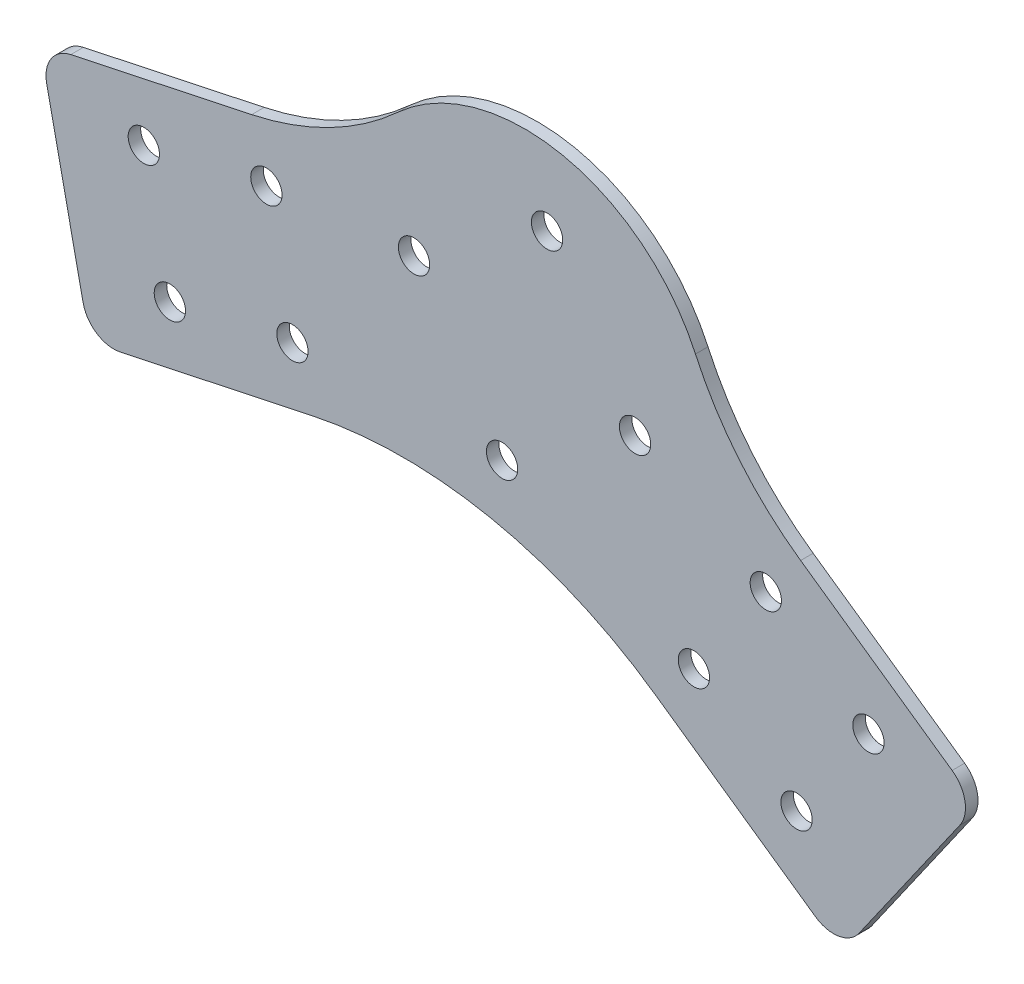
ISO-10303-21;
HEADER;
FILE_DESCRIPTION(('STEP AP214'),'2;1');
FILE_NAME('part.step','',(''),(''),'','','');
FILE_SCHEMA(('AUTOMOTIVE_DESIGN { 1 0 10303 214 1 1 1 1 }'));
ENDSEC;
DATA;
#1=APPLICATION_CONTEXT('core data for automotive mechanical design processes');
#2=APPLICATION_PROTOCOL_DEFINITION('international standard','automotive_design',2000,#1);
#3=PRODUCT_CONTEXT('',#1,'mechanical');
#4=PRODUCT('Part','Part','',(#3));
#5=PRODUCT_RELATED_PRODUCT_CATEGORY('part','',(#4));
#6=PRODUCT_DEFINITION_FORMATION('','',#4);
#7=PRODUCT_DEFINITION_CONTEXT('part definition',#1,'design');
#8=PRODUCT_DEFINITION('design','',#6,#7);
#9=PRODUCT_DEFINITION_SHAPE('','',#8);
#10=(LENGTH_UNIT() NAMED_UNIT(*) SI_UNIT(.MILLI.,.METRE.));
#11=(NAMED_UNIT(*) PLANE_ANGLE_UNIT() SI_UNIT($,.RADIAN.));
#12=(NAMED_UNIT(*) SI_UNIT($,.STERADIAN.) SOLID_ANGLE_UNIT());
#13=UNCERTAINTY_MEASURE_WITH_UNIT(LENGTH_MEASURE(1.E-05),#10,'distance_accuracy_value','');
#14=(GEOMETRIC_REPRESENTATION_CONTEXT(3) GLOBAL_UNCERTAINTY_ASSIGNED_CONTEXT((#13)) GLOBAL_UNIT_ASSIGNED_CONTEXT((#10,
#11,#12)) REPRESENTATION_CONTEXT('',''));
#15=CARTESIAN_POINT('',(0.,0.,0.));
#16=DIRECTION('',(0.,0.,1.));
#17=DIRECTION('',(1.,0.,0.));
#18=AXIS2_PLACEMENT_3D('',#15,#16,#17);
#19=CARTESIAN_POINT('',(0.,0.,2.));
#20=DIRECTION('',(0.,0.,1.));
#21=DIRECTION('',(1.,0.,0.));
#22=AXIS2_PLACEMENT_3D('',#19,#20,#21);
#23=PLANE('',#22);
#24=CARTESIAN_POINT('',(3.5886228195096,17.6386446831749,2.));
#25=DIRECTION('',(0.,0.,1.));
#26=DIRECTION('',(1.,0.,0.));
#27=AXIS2_PLACEMENT_3D('',#24,#25,#26);
#28=CIRCLE('',#27,2.5);
#29=CARTESIAN_POINT('',(6.0886228195096,17.6386446831749,2.));
#30=VERTEX_POINT('',#29);
#31=EDGE_CURVE('E551',#30,#30,#28,.T.);
#32=ORIENTED_EDGE('',*,*,#31,.F.);
#33=EDGE_LOOP('',(#32));
#34=FACE_BOUND('',#33,.T.);
#35=CARTESIAN_POINT('',(17.6386446831753,-3.58862281950917,2.));
#36=DIRECTION('',(0.,0.,1.));
#37=DIRECTION('',(1.,0.,0.));
#38=AXIS2_PLACEMENT_3D('',#35,#36,#37);
#39=CIRCLE('',#38,2.5);
#40=CARTESIAN_POINT('',(20.1386446831753,-3.58862281950917,2.));
#41=VERTEX_POINT('',#40);
#42=EDGE_CURVE('E539',#41,#41,#39,.T.);
#43=ORIENTED_EDGE('',*,*,#42,.F.);
#44=EDGE_LOOP('',(#43));
#45=FACE_BOUND('',#44,.T.);
#46=CARTESIAN_POINT('',(43.4133582938288,-42.6061066239529,2.));
#47=DIRECTION('',(0.,0.,1.));
#48=DIRECTION('',(1.,0.,0.));
#49=AXIS2_PLACEMENT_3D('',#46,#47,#48);
#50=CIRCLE('',#49,2.5);
#51=CARTESIAN_POINT('',(45.9133582938288,-42.6061066239529,2.));
#52=VERTEX_POINT('',#51);
#53=EDGE_CURVE('E527',#52,#52,#50,.T.);
#54=ORIENTED_EDGE('',*,*,#53,.F.);
#55=EDGE_LOOP('',(#54));
#56=FACE_BOUND('',#55,.T.);
#57=CARTESIAN_POINT('',(38.5018461350701,-14.7515370111521,2.));
#58=DIRECTION('',(0.,0.,1.));
#59=DIRECTION('',(1.,0.,0.));
#60=AXIS2_PLACEMENT_3D('',#57,#58,#59);
#61=CIRCLE('',#60,2.5);
#62=CARTESIAN_POINT('',(41.0018461350701,-14.7515370111521,2.));
#63=VERTEX_POINT('',#62);
#64=EDGE_CURVE('E515',#63,#63,#61,.T.);
#65=ORIENTED_EDGE('',*,*,#64,.F.);
#66=EDGE_LOOP('',(#65));
#67=FACE_BOUND('',#66,.T.);
#68=CARTESIAN_POINT('',(-37.0467871211747,-18.0979436400483,2.));
#69=DIRECTION('',(0.,0.,1.));
#70=DIRECTION('',(1.,0.,0.));
#71=AXIS2_PLACEMENT_3D('',#68,#69,#70);
#72=CIRCLE('',#71,2.49999999999999);
#73=CARTESIAN_POINT('',(-34.5467871211747,-18.0979436400483,2.));
#74=VERTEX_POINT('',#73);
#75=EDGE_CURVE('E504',#74,#74,#72,.T.);
#76=ORIENTED_EDGE('',*,*,#75,.F.);
#77=EDGE_LOOP('',(#76));
#78=FACE_BOUND('',#77,.T.);
#79=CARTESIAN_POINT('',(-60.7679729522059,-2.69322544172733,2.));
#80=DIRECTION('',(0.,0.,1.));
#81=DIRECTION('',(1.,0.,0.));
#82=AXIS2_PLACEMENT_3D('',#79,#80,#81);
#83=CIRCLE('',#82,2.49999999999999);
#84=CARTESIAN_POINT('',(-58.2679729522059,-2.69322544172733,2.));
#85=VERTEX_POINT('',#84);
#86=EDGE_CURVE('E172',#85,#85,#83,.T.);
#87=ORIENTED_EDGE('',*,*,#86,.F.);
#88=EDGE_LOOP('',(#87));
#89=FACE_BOUND('',#88,.T.);
#90=DIRECTION('',(0.57357643635105,0.819152044288989,0.));
#91=VECTOR('',#90,1.);
#92=CARTESIAN_POINT('',(50.5384510310042,-58.5821215678195,2.));
#93=LINE('',#92,#91);
#94=CARTESIAN_POINT('',(53.4063332127595,-54.4863613463746,2.));
#95=VERTEX_POINT('',#94);
#96=CARTESIAN_POINT('',(69.4664734305889,-31.5501041062829,2.));
#97=VERTEX_POINT('',#96);
#98=EDGE_CURVE('E269',#95,#97,#93,.T.);
#99=ORIENTED_EDGE('',*,*,#98,.T.);
#100=CARTESIAN_POINT('',(65.3707132091439,-28.6822219245277,2.));
#101=DIRECTION('',(0.,0.,1.));
#102=DIRECTION('',(1.,0.,0.));
#103=AXIS2_PLACEMENT_3D('',#100,#101,#102);
#104=CIRCLE('',#103,5.);
#105=CARTESIAN_POINT('',(68.2385953908992,-24.5864617030827,2.));
#106=VERTEX_POINT('',#105);
#107=EDGE_CURVE('E235',#97,#106,#104,.T.);
#108=ORIENTED_EDGE('',*,*,#107,.T.);
#109=DIRECTION('',(-0.819152044288989,0.57357643635105,0.));
#110=VECTOR('',#109,1.);
#111=CARTESIAN_POINT('',(72.3343556123441,-27.454343884838,2.));
#112=LINE('',#111,#110);
#113=CARTESIAN_POINT('',(44.0609664397997,-7.65710365548538,2.));
#114=VERTEX_POINT('',#113);
#115=EDGE_CURVE('E271',#106,#114,#112,.T.);
#116=ORIENTED_EDGE('',*,*,#115,.T.);
#117=CARTESIAN_POINT('',(72.7397882573522,33.3004985589641,2.));
#118=DIRECTION('',(0.,0.,1.));
#119=DIRECTION('',(1.,0.,0.));
#120=AXIS2_PLACEMENT_3D('',#117,#118,#119);
#121=CIRCLE('',#120,50.);
#122=CARTESIAN_POINT('',(27.2774205965071,12.4876869596115,2.));
#123=VERTEX_POINT('',#122);
#124=EDGE_CURVE('E202',#114,#123,#121,.F.);
#125=ORIENTED_EDGE('',*,*,#124,.T.);
#126=CARTESIAN_POINT('',(0.,0.,2.));
#127=DIRECTION('',(0.,0.,1.));
#128=DIRECTION('',(1.,0.,0.));
#129=AXIS2_PLACEMENT_3D('',#126,#127,#128);
#130=CIRCLE('',#129,30.);
#131=CARTESIAN_POINT('',(-20.2296700307983,22.1531137866671,2.));
#132=VERTEX_POINT('',#131);
#133=EDGE_CURVE('E164',#123,#132,#130,.T.);
#134=ORIENTED_EDGE('',*,*,#133,.T.);
#135=CARTESIAN_POINT('',(-53.9457867487956,59.0749700977789,2.));
#136=DIRECTION('',(0.,0.,1.));
#137=DIRECTION('',(1.,0.,0.));
#138=AXIS2_PLACEMENT_3D('',#135,#136,#137);
#139=CIRCLE('',#138,50.);
#140=CARTESIAN_POINT('',(-43.5502022079078,10.1675900610886,2.));
#141=VERTEX_POINT('',#140);
#142=EDGE_CURVE('E152',#132,#141,#139,.F.);
#143=ORIENTED_EDGE('',*,*,#142,.T.);
#144=DIRECTION('',(-0.978147600733806,-0.207911690817757,0.));
#145=VECTOR('',#144,1.);
#146=CARTESIAN_POINT('',(-77.3113921805728,2.99142760261058,2.));
#147=LINE('',#146,#145);
#148=CARTESIAN_POINT('',(-72.4206541769038,4.03098605669936,2.));
#149=VERTEX_POINT('',#148);
#150=EDGE_CURVE('E162',#141,#149,#147,.T.);
#151=ORIENTED_EDGE('',*,*,#150,.T.);
#152=CARTESIAN_POINT('',(-71.381095722815,-0.859751946969667,2.));
#153=DIRECTION('',(0.,0.,1.));
#154=DIRECTION('',(1.,0.,0.));
#155=AXIS2_PLACEMENT_3D('',#152,#153,#154);
#156=CIRCLE('',#155,5.);
#157=CARTESIAN_POINT('',(-76.271833726484,-1.89931040105845,2.));
#158=VERTEX_POINT('',#157);
#159=EDGE_CURVE('E230',#149,#158,#156,.T.);
#160=ORIENTED_EDGE('',*,*,#159,.T.);
#161=DIRECTION('',(0.207911690817756,-0.978147600733806,0.));
#162=VECTOR('',#161,1.);
#163=CARTESIAN_POINT('',(-77.3113921805728,2.99142760261058,2.));
#164=LINE('',#163,#162);
#165=CARTESIAN_POINT('',(-70.4503063835869,-29.287443221605,2.));
#166=VERTEX_POINT('',#165);
#167=EDGE_CURVE('E247',#158,#166,#164,.T.);
#168=ORIENTED_EDGE('',*,*,#167,.T.);
#169=CARTESIAN_POINT('',(-65.5595683799178,-28.2478847675162,2.));
#170=DIRECTION('',(0.,0.,1.));
#171=DIRECTION('',(1.,0.,0.));
#172=AXIS2_PLACEMENT_3D('',#169,#170,#171);
#173=CIRCLE('',#172,5.);
#174=CARTESIAN_POINT('',(-64.520009925829,-33.1386227711853,2.));
#175=VERTEX_POINT('',#174);
#176=EDGE_CURVE('E62',#166,#175,#173,.T.);
#177=ORIENTED_EDGE('',*,*,#176,.T.);
#178=DIRECTION('',(0.978147600733806,0.207911690817757,0.));
#179=VECTOR('',#178,1.);
#180=CARTESIAN_POINT('',(-69.4107479294981,-34.1781812252741,2.));
#181=LINE('',#180,#179);
#182=CARTESIAN_POINT('',(-33.9023285134918,-26.6306336838708,2.));
#183=VERTEX_POINT('',#182);
#184=EDGE_CURVE('E253',#175,#183,#181,.T.);
#185=ORIENTED_EDGE('',*,*,#184,.T.);
#186=CARTESIAN_POINT('',(-19.3485101562488,-95.1009657352373,2.));
#187=DIRECTION('',(0.,0.,1.));
#188=DIRECTION('',(1.,0.,0.));
#189=AXIS2_PLACEMENT_3D('',#186,#187,#188);
#190=CIRCLE('',#189,70.);
#191=CARTESIAN_POINT('',(20.8018403883247,-37.760322635008,2.));
#192=VERTEX_POINT('',#191);
#193=EDGE_CURVE('E213',#183,#192,#190,.F.);
#194=ORIENTED_EDGE('',*,*,#193,.T.);
#195=DIRECTION('',(0.819152044288989,-0.57357643635105,0.));
#196=VECTOR('',#195,1.);
#197=CARTESIAN_POINT('',(-4.13058081987337,-20.3024533592079,2.));
#198=LINE('',#197,#196);
#199=CARTESIAN_POINT('',(46.4426908095593,-55.7142393860643,2.));
#200=VERTEX_POINT('',#199);
#201=EDGE_CURVE('E266',#192,#200,#198,.T.);
#202=ORIENTED_EDGE('',*,*,#201,.T.);
#203=CARTESIAN_POINT('',(49.3105729913146,-51.6184791646194,2.));
#204=DIRECTION('',(0.,0.,1.));
#205=DIRECTION('',(1.,0.,0.));
#206=AXIS2_PLACEMENT_3D('',#203,#204,#205);
#207=CIRCLE('',#206,5.);
#208=EDGE_CURVE('E233',#200,#95,#207,.T.);
#209=ORIENTED_EDGE('',*,*,#208,.T.);
#210=EDGE_LOOP('',(#99,#108,#116,#125,#134,#143,#151,#160,#168,#177,#185,#194,#202,#209));
#211=FACE_BOUND('',#210,.T.);
#212=CARTESIAN_POINT('',(-56.6097391358508,-22.2561774564035,2.));
#213=DIRECTION('',(0.,0.,1.));
#214=DIRECTION('',(-1.,0.,0.));
#215=AXIS2_PLACEMENT_3D('',#212,#213,#214);
#216=CIRCLE('',#215,2.49999999999999);
#217=CARTESIAN_POINT('',(-59.1097391358508,-22.2561774564035,2.));
#218=VERTEX_POINT('',#217);
#219=EDGE_CURVE('E452',#218,#218,#216,.T.);
#220=ORIENTED_EDGE('',*,*,#219,.F.);
#221=EDGE_LOOP('',(#220));
#222=FACE_BOUND('',#221,.T.);
#223=CARTESIAN_POINT('',(-41.2050209375298,1.4650083746278,2.));
#224=DIRECTION('',(0.,0.,1.));
#225=DIRECTION('',(-1.,0.,0.));
#226=AXIS2_PLACEMENT_3D('',#223,#224,#225);
#227=CIRCLE('',#226,2.50000000000001);
#228=CARTESIAN_POINT('',(-43.7050209375298,1.4650083746278,2.));
#229=VERTEX_POINT('',#228);
#230=EDGE_CURVE('E509',#229,#229,#227,.T.);
#231=ORIENTED_EDGE('',*,*,#230,.F.);
#232=EDGE_LOOP('',(#231));
#233=FACE_BOUND('',#232,.T.);
#234=CARTESIAN_POINT('',(27.0303174080491,-31.1345778969319,2.));
#235=DIRECTION('',(0.,0.,1.));
#236=DIRECTION('',(-1.,0.,0.));
#237=AXIS2_PLACEMENT_3D('',#234,#235,#236);
#238=CIRCLE('',#237,2.5);
#239=CARTESIAN_POINT('',(24.5303174080491,-31.1345778969319,2.));
#240=VERTEX_POINT('',#239);
#241=EDGE_CURVE('E521',#240,#240,#238,.T.);
#242=ORIENTED_EDGE('',*,*,#241,.F.);
#243=EDGE_LOOP('',(#242));
#244=FACE_BOUND('',#243,.T.);
#245=CARTESIAN_POINT('',(54.8848870208499,-26.2230657381731,2.));
#246=DIRECTION('',(0.,0.,1.));
#247=DIRECTION('',(-1.,0.,0.));
#248=AXIS2_PLACEMENT_3D('',#245,#246,#247);
#249=CIRCLE('',#248,2.49999999999999);
#250=CARTESIAN_POINT('',(52.3848870208499,-26.2230657381731,2.));
#251=VERTEX_POINT('',#250);
#252=EDGE_CURVE('E533',#251,#251,#249,.T.);
#253=ORIENTED_EDGE('',*,*,#252,.F.);
#254=EDGE_LOOP('',(#253));
#255=FACE_BOUND('',#254,.T.);
#256=CARTESIAN_POINT('',(-3.58862281950875,-17.6386446831749,2.));
#257=DIRECTION('',(0.,0.,1.));
#258=DIRECTION('',(1.,0.,0.));
#259=AXIS2_PLACEMENT_3D('',#256,#257,#258);
#260=CIRCLE('',#259,2.5);
#261=CARTESIAN_POINT('',(-1.08862281950875,-17.6386446831749,2.));
#262=VERTEX_POINT('',#261);
#263=EDGE_CURVE('E545',#262,#262,#260,.T.);
#264=ORIENTED_EDGE('',*,*,#263,.F.);
#265=EDGE_LOOP('',(#264));
#266=FACE_BOUND('',#265,.T.);
#267=CARTESIAN_POINT('',(-17.6386446831745,3.58862281950917,2.));
#268=DIRECTION('',(0.,0.,1.));
#269=DIRECTION('',(1.,0.,0.));
#270=AXIS2_PLACEMENT_3D('',#267,#268,#269);
#271=CIRCLE('',#270,2.5);
#272=CARTESIAN_POINT('',(-15.1386446831745,3.58862281950917,2.));
#273=VERTEX_POINT('',#272);
#274=EDGE_CURVE('E557',#273,#273,#271,.T.);
#275=ORIENTED_EDGE('',*,*,#274,.F.);
#276=EDGE_LOOP('',(#275));
#277=FACE_BOUND('',#276,.T.);
#278=ADVANCED_FACE('F39',(#34,#45,#56,#67,#78,#89,#211,#222,#233,#244,#255,#266,#277),#23,.T.);
#279=CARTESIAN_POINT('',(0.,0.,0.));
#280=DIRECTION('',(0.,0.,1.));
#281=DIRECTION('',(1.,0.,0.));
#282=AXIS2_PLACEMENT_3D('',#279,#280,#281);
#283=PLANE('',#282);
#284=DIRECTION('',(-0.819152044288989,0.57357643635105,0.));
#285=VECTOR('',#284,1.);
#286=CARTESIAN_POINT('',(72.3343556123441,-27.454343884838,0.));
#287=LINE('',#286,#285);
#288=CARTESIAN_POINT('',(68.2385953908992,-24.5864617030827,0.));
#289=VERTEX_POINT('',#288);
#290=CARTESIAN_POINT('',(44.0609664397997,-7.65710365548538,0.));
#291=VERTEX_POINT('',#290);
#292=EDGE_CURVE('E189',#289,#291,#287,.T.);
#293=ORIENTED_EDGE('',*,*,#292,.F.);
#294=CARTESIAN_POINT('',(65.3707132091439,-28.6822219245277,0.));
#295=DIRECTION('',(0.,0.,1.));
#296=DIRECTION('',(1.,0.,0.));
#297=AXIS2_PLACEMENT_3D('',#294,#295,#296);
#298=CIRCLE('',#297,5.);
#299=CARTESIAN_POINT('',(69.4664734305889,-31.5501041062829,0.));
#300=VERTEX_POINT('',#299);
#301=EDGE_CURVE('E223',#289,#300,#298,.F.);
#302=ORIENTED_EDGE('',*,*,#301,.T.);
#303=DIRECTION('',(0.57357643635105,0.819152044288989,0.));
#304=VECTOR('',#303,1.);
#305=CARTESIAN_POINT('',(50.5384510310042,-58.5821215678195,0.));
#306=LINE('',#305,#304);
#307=CARTESIAN_POINT('',(53.4063332127595,-54.4863613463746,0.));
#308=VERTEX_POINT('',#307);
#309=EDGE_CURVE('E186',#308,#300,#306,.T.);
#310=ORIENTED_EDGE('',*,*,#309,.F.);
#311=CARTESIAN_POINT('',(49.3105729913146,-51.6184791646194,0.));
#312=DIRECTION('',(0.,0.,1.));
#313=DIRECTION('',(1.,0.,0.));
#314=AXIS2_PLACEMENT_3D('',#311,#312,#313);
#315=CIRCLE('',#314,5.);
#316=CARTESIAN_POINT('',(46.4426908095593,-55.7142393860643,0.));
#317=VERTEX_POINT('',#316);
#318=EDGE_CURVE('E221',#308,#317,#315,.F.);
#319=ORIENTED_EDGE('',*,*,#318,.T.);
#320=DIRECTION('',(0.819152044288989,-0.57357643635105,0.));
#321=VECTOR('',#320,1.);
#322=CARTESIAN_POINT('',(-4.13058081987337,-20.3024533592079,0.));
#323=LINE('',#322,#321);
#324=CARTESIAN_POINT('',(20.8018403883247,-37.760322635008,0.));
#325=VERTEX_POINT('',#324);
#326=EDGE_CURVE('E184',#325,#317,#323,.T.);
#327=ORIENTED_EDGE('',*,*,#326,.F.);
#328=CARTESIAN_POINT('',(-19.3485101562488,-95.1009657352373,0.));
#329=DIRECTION('',(0.,0.,1.));
#330=DIRECTION('',(1.,0.,0.));
#331=AXIS2_PLACEMENT_3D('',#328,#329,#330);
#332=CIRCLE('',#331,70.);
#333=CARTESIAN_POINT('',(-33.9023285134918,-26.6306336838708,0.));
#334=VERTEX_POINT('',#333);
#335=EDGE_CURVE('E210',#325,#334,#332,.T.);
#336=ORIENTED_EDGE('',*,*,#335,.T.);
#337=DIRECTION('',(0.978147600733806,0.207911690817757,0.));
#338=VECTOR('',#337,1.);
#339=CARTESIAN_POINT('',(-69.4107479294981,-34.1781812252741,0.));
#340=LINE('',#339,#338);
#341=CARTESIAN_POINT('',(-64.520009925829,-33.1386227711853,0.));
#342=VERTEX_POINT('',#341);
#343=EDGE_CURVE('E175',#342,#334,#340,.T.);
#344=ORIENTED_EDGE('',*,*,#343,.F.);
#345=CARTESIAN_POINT('',(-65.5595683799178,-28.2478847675162,0.));
#346=DIRECTION('',(0.,0.,1.));
#347=DIRECTION('',(1.,0.,0.));
#348=AXIS2_PLACEMENT_3D('',#345,#346,#347);
#349=CIRCLE('',#348,5.);
#350=CARTESIAN_POINT('',(-70.4503063835869,-29.287443221605,0.));
#351=VERTEX_POINT('',#350);
#352=EDGE_CURVE('E219',#342,#351,#349,.F.);
#353=ORIENTED_EDGE('',*,*,#352,.T.);
#354=DIRECTION('',(0.207911690817756,-0.978147600733806,0.));
#355=VECTOR('',#354,1.);
#356=CARTESIAN_POINT('',(-77.3113921805728,2.99142760261058,0.));
#357=LINE('',#356,#355);
#358=CARTESIAN_POINT('',(-76.271833726484,-1.89931040105845,0.));
#359=VERTEX_POINT('',#358);
#360=EDGE_CURVE('E171',#359,#351,#357,.T.);
#361=ORIENTED_EDGE('',*,*,#360,.F.);
#362=CARTESIAN_POINT('',(-71.381095722815,-0.859751946969667,0.));
#363=DIRECTION('',(0.,0.,1.));
#364=DIRECTION('',(1.,0.,0.));
#365=AXIS2_PLACEMENT_3D('',#362,#363,#364);
#366=CIRCLE('',#365,5.);
#367=CARTESIAN_POINT('',(-72.4206541769038,4.03098605669936,0.));
#368=VERTEX_POINT('',#367);
#369=EDGE_CURVE('E170',#359,#368,#366,.F.);
#370=ORIENTED_EDGE('',*,*,#369,.T.);
#371=DIRECTION('',(-0.978147600733806,-0.207911690817757,0.));
#372=VECTOR('',#371,1.);
#373=CARTESIAN_POINT('',(-77.3113921805728,2.99142760261058,0.));
#374=LINE('',#373,#372);
#375=CARTESIAN_POINT('',(-43.5502022079078,10.1675900610886,0.));
#376=VERTEX_POINT('',#375);
#377=EDGE_CURVE('E159',#376,#368,#374,.T.);
#378=ORIENTED_EDGE('',*,*,#377,.F.);
#379=CARTESIAN_POINT('',(-53.9457867487956,59.0749700977789,0.));
#380=DIRECTION('',(0.,0.,1.));
#381=DIRECTION('',(1.,0.,0.));
#382=AXIS2_PLACEMENT_3D('',#379,#380,#381);
#383=CIRCLE('',#382,50.);
#384=CARTESIAN_POINT('',(-20.2296700307983,22.1531137866671,0.));
#385=VERTEX_POINT('',#384);
#386=EDGE_CURVE('E142',#376,#385,#383,.T.);
#387=ORIENTED_EDGE('',*,*,#386,.T.);
#388=CARTESIAN_POINT('',(0.,0.,0.));
#389=DIRECTION('',(0.,0.,1.));
#390=DIRECTION('',(1.,0.,0.));
#391=AXIS2_PLACEMENT_3D('',#388,#389,#390);
#392=CIRCLE('',#391,30.);
#393=CARTESIAN_POINT('',(27.2774205965071,12.4876869596115,0.));
#394=VERTEX_POINT('',#393);
#395=EDGE_CURVE('E191',#394,#385,#392,.T.);
#396=ORIENTED_EDGE('',*,*,#395,.F.);
#397=CARTESIAN_POINT('',(72.7397882573522,33.3004985589641,0.));
#398=DIRECTION('',(0.,0.,1.));
#399=DIRECTION('',(1.,0.,0.));
#400=AXIS2_PLACEMENT_3D('',#397,#398,#399);
#401=CIRCLE('',#400,50.);
#402=EDGE_CURVE('E199',#394,#291,#401,.T.);
#403=ORIENTED_EDGE('',*,*,#402,.T.);
#404=EDGE_LOOP('',(#293,#302,#310,#319,#327,#336,#344,#353,#361,#370,#378,#387,#396,#403));
#405=FACE_BOUND('',#404,.T.);
#406=CARTESIAN_POINT('',(-60.7679729522059,-2.69322544172733,0.));
#407=DIRECTION('',(0.,0.,1.));
#408=DIRECTION('',(1.,0.,0.));
#409=AXIS2_PLACEMENT_3D('',#406,#407,#408);
#410=CIRCLE('',#409,2.49999999999999);
#411=CARTESIAN_POINT('',(-58.2679729522059,-2.69322544172733,0.));
#412=VERTEX_POINT('',#411);
#413=EDGE_CURVE('E178',#412,#412,#410,.T.);
#414=ORIENTED_EDGE('',*,*,#413,.T.);
#415=EDGE_LOOP('',(#414));
#416=FACE_BOUND('',#415,.T.);
#417=CARTESIAN_POINT('',(-56.6097391358508,-22.2561774564035,0.));
#418=DIRECTION('',(0.,0.,1.));
#419=DIRECTION('',(-1.,0.,0.));
#420=AXIS2_PLACEMENT_3D('',#417,#418,#419);
#421=CIRCLE('',#420,2.49999999999999);
#422=CARTESIAN_POINT('',(-59.1097391358508,-22.2561774564035,0.));
#423=VERTEX_POINT('',#422);
#424=EDGE_CURVE('E455',#423,#423,#421,.T.);
#425=ORIENTED_EDGE('',*,*,#424,.T.);
#426=EDGE_LOOP('',(#425));
#427=FACE_BOUND('',#426,.T.);
#428=CARTESIAN_POINT('',(-37.0467871211747,-18.0979436400483,0.));
#429=DIRECTION('',(0.,0.,1.));
#430=DIRECTION('',(1.,0.,0.));
#431=AXIS2_PLACEMENT_3D('',#428,#429,#430);
#432=CIRCLE('',#431,2.49999999999999);
#433=CARTESIAN_POINT('',(-34.5467871211747,-18.0979436400483,0.));
#434=VERTEX_POINT('',#433);
#435=EDGE_CURVE('E506',#434,#434,#432,.T.);
#436=ORIENTED_EDGE('',*,*,#435,.T.);
#437=EDGE_LOOP('',(#436));
#438=FACE_BOUND('',#437,.T.);
#439=CARTESIAN_POINT('',(-41.2050209375298,1.4650083746278,0.));
#440=DIRECTION('',(0.,0.,1.));
#441=DIRECTION('',(-1.,0.,0.));
#442=AXIS2_PLACEMENT_3D('',#439,#440,#441);
#443=CIRCLE('',#442,2.50000000000001);
#444=CARTESIAN_POINT('',(-43.7050209375298,1.4650083746278,0.));
#445=VERTEX_POINT('',#444);
#446=EDGE_CURVE('E512',#445,#445,#443,.T.);
#447=ORIENTED_EDGE('',*,*,#446,.T.);
#448=EDGE_LOOP('',(#447));
#449=FACE_BOUND('',#448,.T.);
#450=CARTESIAN_POINT('',(38.5018461350701,-14.7515370111521,0.));
#451=DIRECTION('',(0.,0.,1.));
#452=DIRECTION('',(1.,0.,0.));
#453=AXIS2_PLACEMENT_3D('',#450,#451,#452);
#454=CIRCLE('',#453,2.5);
#455=CARTESIAN_POINT('',(41.0018461350701,-14.7515370111521,0.));
#456=VERTEX_POINT('',#455);
#457=EDGE_CURVE('E518',#456,#456,#454,.T.);
#458=ORIENTED_EDGE('',*,*,#457,.T.);
#459=EDGE_LOOP('',(#458));
#460=FACE_BOUND('',#459,.T.);
#461=CARTESIAN_POINT('',(27.0303174080491,-31.1345778969319,0.));
#462=DIRECTION('',(0.,0.,1.));
#463=DIRECTION('',(-1.,0.,0.));
#464=AXIS2_PLACEMENT_3D('',#461,#462,#463);
#465=CIRCLE('',#464,2.5);
#466=CARTESIAN_POINT('',(24.5303174080491,-31.1345778969319,0.));
#467=VERTEX_POINT('',#466);
#468=EDGE_CURVE('E524',#467,#467,#465,.T.);
#469=ORIENTED_EDGE('',*,*,#468,.T.);
#470=EDGE_LOOP('',(#469));
#471=FACE_BOUND('',#470,.T.);
#472=CARTESIAN_POINT('',(43.4133582938288,-42.6061066239529,0.));
#473=DIRECTION('',(0.,0.,1.));
#474=DIRECTION('',(1.,0.,0.));
#475=AXIS2_PLACEMENT_3D('',#472,#473,#474);
#476=CIRCLE('',#475,2.5);
#477=CARTESIAN_POINT('',(45.9133582938288,-42.6061066239529,0.));
#478=VERTEX_POINT('',#477);
#479=EDGE_CURVE('E530',#478,#478,#476,.T.);
#480=ORIENTED_EDGE('',*,*,#479,.T.);
#481=EDGE_LOOP('',(#480));
#482=FACE_BOUND('',#481,.T.);
#483=CARTESIAN_POINT('',(54.8848870208499,-26.2230657381731,0.));
#484=DIRECTION('',(0.,0.,1.));
#485=DIRECTION('',(-1.,0.,0.));
#486=AXIS2_PLACEMENT_3D('',#483,#484,#485);
#487=CIRCLE('',#486,2.49999999999999);
#488=CARTESIAN_POINT('',(52.3848870208499,-26.2230657381731,0.));
#489=VERTEX_POINT('',#488);
#490=EDGE_CURVE('E536',#489,#489,#487,.T.);
#491=ORIENTED_EDGE('',*,*,#490,.T.);
#492=EDGE_LOOP('',(#491));
#493=FACE_BOUND('',#492,.T.);
#494=CARTESIAN_POINT('',(17.6386446831753,-3.58862281950917,0.));
#495=DIRECTION('',(0.,0.,1.));
#496=DIRECTION('',(1.,0.,0.));
#497=AXIS2_PLACEMENT_3D('',#494,#495,#496);
#498=CIRCLE('',#497,2.5);
#499=CARTESIAN_POINT('',(20.1386446831753,-3.58862281950917,0.));
#500=VERTEX_POINT('',#499);
#501=EDGE_CURVE('E542',#500,#500,#498,.T.);
#502=ORIENTED_EDGE('',*,*,#501,.T.);
#503=EDGE_LOOP('',(#502));
#504=FACE_BOUND('',#503,.T.);
#505=CARTESIAN_POINT('',(-3.58862281950875,-17.6386446831749,0.));
#506=DIRECTION('',(0.,0.,1.));
#507=DIRECTION('',(1.,0.,0.));
#508=AXIS2_PLACEMENT_3D('',#505,#506,#507);
#509=CIRCLE('',#508,2.5);
#510=CARTESIAN_POINT('',(-1.08862281950875,-17.6386446831749,0.));
#511=VERTEX_POINT('',#510);
#512=EDGE_CURVE('E548',#511,#511,#509,.T.);
#513=ORIENTED_EDGE('',*,*,#512,.T.);
#514=EDGE_LOOP('',(#513));
#515=FACE_BOUND('',#514,.T.);
#516=CARTESIAN_POINT('',(3.5886228195096,17.6386446831749,0.));
#517=DIRECTION('',(0.,0.,1.));
#518=DIRECTION('',(1.,0.,0.));
#519=AXIS2_PLACEMENT_3D('',#516,#517,#518);
#520=CIRCLE('',#519,2.5);
#521=CARTESIAN_POINT('',(6.0886228195096,17.6386446831749,0.));
#522=VERTEX_POINT('',#521);
#523=EDGE_CURVE('E554',#522,#522,#520,.T.);
#524=ORIENTED_EDGE('',*,*,#523,.T.);
#525=EDGE_LOOP('',(#524));
#526=FACE_BOUND('',#525,.T.);
#527=CARTESIAN_POINT('',(-17.6386446831745,3.58862281950917,0.));
#528=DIRECTION('',(0.,0.,1.));
#529=DIRECTION('',(1.,0.,0.));
#530=AXIS2_PLACEMENT_3D('',#527,#528,#529);
#531=CIRCLE('',#530,2.5);
#532=CARTESIAN_POINT('',(-15.1386446831745,3.58862281950917,0.));
#533=VERTEX_POINT('',#532);
#534=EDGE_CURVE('E560',#533,#533,#531,.T.);
#535=ORIENTED_EDGE('',*,*,#534,.T.);
#536=EDGE_LOOP('',(#535));
#537=FACE_BOUND('',#536,.T.);
#538=ADVANCED_FACE('F167',(#405,#416,#427,#438,#449,#460,#471,#482,#493,#504,#515,#526,#537),
#283,.F.);
#539=CARTESIAN_POINT('',(-77.3113921805728,2.99142760261058,2.));
#540=DIRECTION('',(0.207911690817757,-0.978147600733806,0.));
#541=DIRECTION('',(0.978147600733806,0.207911690817757,0.));
#542=AXIS2_PLACEMENT_3D('',#539,#540,#541);
#543=PLANE('',#542);
#544=ORIENTED_EDGE('',*,*,#377,.T.);
#545=DIRECTION('',(0.,0.,-1.));
#546=VECTOR('',#545,1.);
#547=CARTESIAN_POINT('',(-72.4206541769038,4.03098605669936,2.));
#548=LINE('',#547,#546);
#549=EDGE_CURVE('E11',#368,#149,#548,.F.);
#550=ORIENTED_EDGE('',*,*,#549,.T.);
#551=ORIENTED_EDGE('',*,*,#150,.F.);
#552=DIRECTION('',(0.,0.,1.));
#553=VECTOR('',#552,1.);
#554=CARTESIAN_POINT('',(-43.5502022079077,10.1675900610886,0.));
#555=LINE('',#554,#553);
#556=EDGE_CURVE('E146',#141,#376,#555,.F.);
#557=ORIENTED_EDGE('',*,*,#556,.T.);
#558=EDGE_LOOP('',(#544,#550,#551,#557));
#559=FACE_BOUND('',#558,.T.);
#560=ADVANCED_FACE('F158',(#559),#543,.F.);
#561=CARTESIAN_POINT('',(-77.3113921805728,2.99142760261058,2.));
#562=DIRECTION('',(0.978147600733806,0.207911690817756,0.));
#563=DIRECTION('',(-0.207911690817756,0.978147600733806,0.));
#564=AXIS2_PLACEMENT_3D('',#561,#562,#563);
#565=PLANE('',#564);
#566=ORIENTED_EDGE('',*,*,#360,.T.);
#567=DIRECTION('',(0.,0.,-1.));
#568=VECTOR('',#567,1.);
#569=CARTESIAN_POINT('',(-70.4503063835869,-29.287443221605,2.));
#570=LINE('',#569,#568);
#571=EDGE_CURVE('E47',#351,#166,#570,.F.);
#572=ORIENTED_EDGE('',*,*,#571,.T.);
#573=ORIENTED_EDGE('',*,*,#167,.F.);
#574=DIRECTION('',(0.,0.,-1.));
#575=VECTOR('',#574,1.);
#576=CARTESIAN_POINT('',(-76.271833726484,-1.89931040105845,2.));
#577=LINE('',#576,#575);
#578=EDGE_CURVE('E241',#158,#359,#577,.T.);
#579=ORIENTED_EDGE('',*,*,#578,.T.);
#580=EDGE_LOOP('',(#566,#572,#573,#579));
#581=FACE_BOUND('',#580,.T.);
#582=ADVANCED_FACE('F246',(#581),#565,.F.);
#583=CARTESIAN_POINT('',(-69.4107479294981,-34.1781812252741,2.));
#584=DIRECTION('',(-0.207911690817757,0.978147600733806,0.));
#585=DIRECTION('',(-0.978147600733806,-0.207911690817757,0.));
#586=AXIS2_PLACEMENT_3D('',#583,#584,#585);
#587=PLANE('',#586);
#588=ORIENTED_EDGE('',*,*,#184,.F.);
#589=DIRECTION('',(0.,0.,-1.));
#590=VECTOR('',#589,1.);
#591=CARTESIAN_POINT('',(-64.520009925829,-33.1386227711853,2.));
#592=LINE('',#591,#590);
#593=EDGE_CURVE('E238',#175,#342,#592,.T.);
#594=ORIENTED_EDGE('',*,*,#593,.T.);
#595=ORIENTED_EDGE('',*,*,#343,.T.);
#596=DIRECTION('',(0.,0.,-1.));
#597=VECTOR('',#596,1.);
#598=CARTESIAN_POINT('',(-33.9023285134918,-26.6306336838708,2.));
#599=LINE('',#598,#597);
#600=EDGE_CURVE('E207',#334,#183,#599,.F.);
#601=ORIENTED_EDGE('',*,*,#600,.T.);
#602=EDGE_LOOP('',(#588,#594,#595,#601));
#603=FACE_BOUND('',#602,.T.);
#604=ADVANCED_FACE('F259',(#603),#587,.F.);
#605=CARTESIAN_POINT('',(-4.13058081987337,-20.3024533592079,2.));
#606=DIRECTION('',(0.57357643635105,0.819152044288989,0.));
#607=DIRECTION('',(-0.819152044288989,0.57357643635105,0.));
#608=AXIS2_PLACEMENT_3D('',#605,#606,#607);
#609=PLANE('',#608);
#610=ORIENTED_EDGE('',*,*,#326,.T.);
#611=DIRECTION('',(0.,0.,-1.));
#612=VECTOR('',#611,1.);
#613=CARTESIAN_POINT('',(46.4426908095593,-55.7142393860643,2.));
#614=LINE('',#613,#612);
#615=EDGE_CURVE('E54',#317,#200,#614,.F.);
#616=ORIENTED_EDGE('',*,*,#615,.T.);
#617=ORIENTED_EDGE('',*,*,#201,.F.);
#618=DIRECTION('',(0.,0.,-1.));
#619=VECTOR('',#618,1.);
#620=CARTESIAN_POINT('',(20.8018403883247,-37.760322635008,0.));
#621=LINE('',#620,#619);
#622=EDGE_CURVE('E204',#192,#325,#621,.T.);
#623=ORIENTED_EDGE('',*,*,#622,.T.);
#624=EDGE_LOOP('',(#610,#616,#617,#623));
#625=FACE_BOUND('',#624,.T.);
#626=ADVANCED_FACE('F268',(#625),#609,.F.);
#627=CARTESIAN_POINT('',(50.5384510310042,-58.5821215678195,2.));
#628=DIRECTION('',(-0.819152044288989,0.57357643635105,0.));
#629=DIRECTION('',(-0.57357643635105,-0.819152044288989,0.));
#630=AXIS2_PLACEMENT_3D('',#627,#628,#629);
#631=PLANE('',#630);
#632=ORIENTED_EDGE('',*,*,#309,.T.);
#633=DIRECTION('',(0.,0.,-1.));
#634=VECTOR('',#633,1.);
#635=CARTESIAN_POINT('',(69.4664734305889,-31.5501041062829,2.));
#636=LINE('',#635,#634);
#637=EDGE_CURVE('E228',#300,#97,#636,.F.);
#638=ORIENTED_EDGE('',*,*,#637,.T.);
#639=ORIENTED_EDGE('',*,*,#98,.F.);
#640=DIRECTION('',(0.,0.,-1.));
#641=VECTOR('',#640,1.);
#642=CARTESIAN_POINT('',(53.4063332127595,-54.4863613463746,2.));
#643=LINE('',#642,#641);
#644=EDGE_CURVE('E225',#95,#308,#643,.T.);
#645=ORIENTED_EDGE('',*,*,#644,.T.);
#646=EDGE_LOOP('',(#632,#638,#639,#645));
#647=FACE_BOUND('',#646,.T.);
#648=ADVANCED_FACE('F294',(#647),#631,.F.);
#649=CARTESIAN_POINT('',(72.3343556123441,-27.454343884838,2.));
#650=DIRECTION('',(-0.57357643635105,-0.819152044288989,0.));
#651=DIRECTION('',(0.819152044288989,-0.57357643635105,0.));
#652=AXIS2_PLACEMENT_3D('',#649,#650,#651);
#653=PLANE('',#652);
#654=ORIENTED_EDGE('',*,*,#115,.F.);
#655=DIRECTION('',(0.,0.,-1.));
#656=VECTOR('',#655,1.);
#657=CARTESIAN_POINT('',(68.2385953908992,-24.5864617030827,2.));
#658=LINE('',#657,#656);
#659=EDGE_CURVE('E215',#106,#289,#658,.T.);
#660=ORIENTED_EDGE('',*,*,#659,.T.);
#661=ORIENTED_EDGE('',*,*,#292,.T.);
#662=DIRECTION('',(0.,0.,1.));
#663=VECTOR('',#662,1.);
#664=CARTESIAN_POINT('',(44.0609664397997,-7.65710365548538,2.));
#665=LINE('',#664,#663);
#666=EDGE_CURVE('E153',#291,#114,#665,.T.);
#667=ORIENTED_EDGE('',*,*,#666,.T.);
#668=EDGE_LOOP('',(#654,#660,#661,#667));
#669=FACE_BOUND('',#668,.T.);
#670=ADVANCED_FACE('F286',(#669),#653,.F.);
#671=CARTESIAN_POINT('',(0.,0.,2.));
#672=DIRECTION('',(0.,0.,-1.));
#673=DIRECTION('',(-1.,0.,0.));
#674=AXIS2_PLACEMENT_3D('',#671,#672,#673);
#675=CYLINDRICAL_SURFACE('',#674,30.);
#676=ORIENTED_EDGE('',*,*,#395,.T.);
#677=DIRECTION('',(0.,0.,-1.));
#678=VECTOR('',#677,1.);
#679=CARTESIAN_POINT('',(-20.2296700307983,22.1531137866671,2.));
#680=LINE('',#679,#678);
#681=EDGE_CURVE('E147',#385,#132,#680,.F.);
#682=ORIENTED_EDGE('',*,*,#681,.T.);
#683=ORIENTED_EDGE('',*,*,#133,.F.);
#684=DIRECTION('',(0.,0.,-1.));
#685=VECTOR('',#684,1.);
#686=CARTESIAN_POINT('',(27.2774205965071,12.4876869596115,2.));
#687=LINE('',#686,#685);
#688=EDGE_CURVE('E163',#123,#394,#687,.T.);
#689=ORIENTED_EDGE('',*,*,#688,.T.);
#690=EDGE_LOOP('',(#676,#682,#683,#689));
#691=FACE_BOUND('',#690,.T.);
#692=ADVANCED_FACE('F280',(#691),#675,.T.);
#693=CARTESIAN_POINT('',(-60.7679729522059,-2.69322544172733,2.));
#694=DIRECTION('',(0.,0.,-1.));
#695=DIRECTION('',(-1.,0.,0.));
#696=AXIS2_PLACEMENT_3D('',#693,#694,#695);
#697=CYLINDRICAL_SURFACE('',#696,2.49999999999999);
#698=ORIENTED_EDGE('',*,*,#86,.T.);
#699=EDGE_LOOP('',(#698));
#700=FACE_BOUND('',#699,.T.);
#701=ORIENTED_EDGE('',*,*,#413,.F.);
#702=EDGE_LOOP('',(#701));
#703=FACE_BOUND('',#702,.T.);
#704=ADVANCED_FACE('F316',(#700,#703),#697,.F.);
#705=CARTESIAN_POINT('',(-56.6097391358508,-22.2561774564035,2.));
#706=DIRECTION('',(0.,0.,-1.));
#707=DIRECTION('',(-1.,0.,0.));
#708=AXIS2_PLACEMENT_3D('',#705,#706,#707);
#709=CYLINDRICAL_SURFACE('',#708,2.49999999999999);
#710=ORIENTED_EDGE('',*,*,#219,.T.);
#711=EDGE_LOOP('',(#710));
#712=FACE_BOUND('',#711,.T.);
#713=ORIENTED_EDGE('',*,*,#424,.F.);
#714=EDGE_LOOP('',(#713));
#715=FACE_BOUND('',#714,.T.);
#716=ADVANCED_FACE('F433',(#712,#715),#709,.F.);
#717=CARTESIAN_POINT('',(-37.0467871211747,-18.0979436400483,2.));
#718=DIRECTION('',(0.,0.,-1.));
#719=DIRECTION('',(-1.,0.,0.));
#720=AXIS2_PLACEMENT_3D('',#717,#718,#719);
#721=CYLINDRICAL_SURFACE('',#720,2.49999999999999);
#722=ORIENTED_EDGE('',*,*,#75,.T.);
#723=EDGE_LOOP('',(#722));
#724=FACE_BOUND('',#723,.T.);
#725=ORIENTED_EDGE('',*,*,#435,.F.);
#726=EDGE_LOOP('',(#725));
#727=FACE_BOUND('',#726,.T.);
#728=ADVANCED_FACE('F425',(#724,#727),#721,.F.);
#729=CARTESIAN_POINT('',(-41.2050209375298,1.4650083746278,2.));
#730=DIRECTION('',(0.,0.,-1.));
#731=DIRECTION('',(-1.,0.,0.));
#732=AXIS2_PLACEMENT_3D('',#729,#730,#731);
#733=CYLINDRICAL_SURFACE('',#732,2.50000000000001);
#734=ORIENTED_EDGE('',*,*,#230,.T.);
#735=EDGE_LOOP('',(#734));
#736=FACE_BOUND('',#735,.T.);
#737=ORIENTED_EDGE('',*,*,#446,.F.);
#738=EDGE_LOOP('',(#737));
#739=FACE_BOUND('',#738,.T.);
#740=ADVANCED_FACE('F417',(#736,#739),#733,.F.);
#741=CARTESIAN_POINT('',(38.5018461350701,-14.7515370111521,2.));
#742=DIRECTION('',(0.,0.,-1.));
#743=DIRECTION('',(-1.,0.,0.));
#744=AXIS2_PLACEMENT_3D('',#741,#742,#743);
#745=CYLINDRICAL_SURFACE('',#744,2.5);
#746=ORIENTED_EDGE('',*,*,#64,.T.);
#747=EDGE_LOOP('',(#746));
#748=FACE_BOUND('',#747,.T.);
#749=ORIENTED_EDGE('',*,*,#457,.F.);
#750=EDGE_LOOP('',(#749));
#751=FACE_BOUND('',#750,.T.);
#752=ADVANCED_FACE('F409',(#748,#751),#745,.F.);
#753=CARTESIAN_POINT('',(27.0303174080491,-31.1345778969319,2.));
#754=DIRECTION('',(0.,0.,-1.));
#755=DIRECTION('',(-1.,0.,0.));
#756=AXIS2_PLACEMENT_3D('',#753,#754,#755);
#757=CYLINDRICAL_SURFACE('',#756,2.5);
#758=ORIENTED_EDGE('',*,*,#241,.T.);
#759=EDGE_LOOP('',(#758));
#760=FACE_BOUND('',#759,.T.);
#761=ORIENTED_EDGE('',*,*,#468,.F.);
#762=EDGE_LOOP('',(#761));
#763=FACE_BOUND('',#762,.T.);
#764=ADVANCED_FACE('F401',(#760,#763),#757,.F.);
#765=CARTESIAN_POINT('',(43.4133582938288,-42.6061066239529,2.));
#766=DIRECTION('',(0.,0.,-1.));
#767=DIRECTION('',(-1.,0.,0.));
#768=AXIS2_PLACEMENT_3D('',#765,#766,#767);
#769=CYLINDRICAL_SURFACE('',#768,2.5);
#770=ORIENTED_EDGE('',*,*,#53,.T.);
#771=EDGE_LOOP('',(#770));
#772=FACE_BOUND('',#771,.T.);
#773=ORIENTED_EDGE('',*,*,#479,.F.);
#774=EDGE_LOOP('',(#773));
#775=FACE_BOUND('',#774,.T.);
#776=ADVANCED_FACE('F393',(#772,#775),#769,.F.);
#777=CARTESIAN_POINT('',(54.8848870208499,-26.2230657381731,2.));
#778=DIRECTION('',(0.,0.,-1.));
#779=DIRECTION('',(-1.,0.,0.));
#780=AXIS2_PLACEMENT_3D('',#777,#778,#779);
#781=CYLINDRICAL_SURFACE('',#780,2.49999999999999);
#782=ORIENTED_EDGE('',*,*,#252,.T.);
#783=EDGE_LOOP('',(#782));
#784=FACE_BOUND('',#783,.T.);
#785=ORIENTED_EDGE('',*,*,#490,.F.);
#786=EDGE_LOOP('',(#785));
#787=FACE_BOUND('',#786,.T.);
#788=ADVANCED_FACE('F385',(#784,#787),#781,.F.);
#789=CARTESIAN_POINT('',(17.6386446831753,-3.58862281950917,2.));
#790=DIRECTION('',(0.,0.,-1.));
#791=DIRECTION('',(-1.,0.,0.));
#792=AXIS2_PLACEMENT_3D('',#789,#790,#791);
#793=CYLINDRICAL_SURFACE('',#792,2.5);
#794=ORIENTED_EDGE('',*,*,#42,.T.);
#795=EDGE_LOOP('',(#794));
#796=FACE_BOUND('',#795,.T.);
#797=ORIENTED_EDGE('',*,*,#501,.F.);
#798=EDGE_LOOP('',(#797));
#799=FACE_BOUND('',#798,.T.);
#800=ADVANCED_FACE('F377',(#796,#799),#793,.F.);
#801=CARTESIAN_POINT('',(-3.58862281950875,-17.6386446831749,2.));
#802=DIRECTION('',(0.,0.,-1.));
#803=DIRECTION('',(-1.,0.,0.));
#804=AXIS2_PLACEMENT_3D('',#801,#802,#803);
#805=CYLINDRICAL_SURFACE('',#804,2.5);
#806=ORIENTED_EDGE('',*,*,#263,.T.);
#807=EDGE_LOOP('',(#806));
#808=FACE_BOUND('',#807,.T.);
#809=ORIENTED_EDGE('',*,*,#512,.F.);
#810=EDGE_LOOP('',(#809));
#811=FACE_BOUND('',#810,.T.);
#812=ADVANCED_FACE('F369',(#808,#811),#805,.F.);
#813=CARTESIAN_POINT('',(3.5886228195096,17.6386446831749,2.));
#814=DIRECTION('',(0.,0.,-1.));
#815=DIRECTION('',(-1.,0.,0.));
#816=AXIS2_PLACEMENT_3D('',#813,#814,#815);
#817=CYLINDRICAL_SURFACE('',#816,2.5);
#818=ORIENTED_EDGE('',*,*,#31,.T.);
#819=EDGE_LOOP('',(#818));
#820=FACE_BOUND('',#819,.T.);
#821=ORIENTED_EDGE('',*,*,#523,.F.);
#822=EDGE_LOOP('',(#821));
#823=FACE_BOUND('',#822,.T.);
#824=ADVANCED_FACE('F361',(#820,#823),#817,.F.);
#825=CARTESIAN_POINT('',(-17.6386446831745,3.58862281950917,2.));
#826=DIRECTION('',(0.,0.,-1.));
#827=DIRECTION('',(-1.,0.,0.));
#828=AXIS2_PLACEMENT_3D('',#825,#826,#827);
#829=CYLINDRICAL_SURFACE('',#828,2.5);
#830=ORIENTED_EDGE('',*,*,#274,.T.);
#831=EDGE_LOOP('',(#830));
#832=FACE_BOUND('',#831,.T.);
#833=ORIENTED_EDGE('',*,*,#534,.F.);
#834=EDGE_LOOP('',(#833));
#835=FACE_BOUND('',#834,.T.);
#836=ADVANCED_FACE('F335',(#832,#835),#829,.F.);
#837=CARTESIAN_POINT('',(-53.9457867487956,59.0749700977789,2.));
#838=DIRECTION('',(0.,0.,-1.));
#839=DIRECTION('',(-1.,0.,0.));
#840=AXIS2_PLACEMENT_3D('',#837,#838,#839);
#841=CYLINDRICAL_SURFACE('',#840,50.);
#842=ORIENTED_EDGE('',*,*,#142,.F.);
#843=ORIENTED_EDGE('',*,*,#681,.F.);
#844=ORIENTED_EDGE('',*,*,#386,.F.);
#845=ORIENTED_EDGE('',*,*,#556,.F.);
#846=EDGE_LOOP('',(#842,#843,#844,#845));
#847=FACE_BOUND('',#846,.T.);
#848=ADVANCED_FACE('F145',(#847),#841,.F.);
#849=CARTESIAN_POINT('',(72.7397882573522,33.3004985589641,2.));
#850=DIRECTION('',(0.,0.,-1.));
#851=DIRECTION('',(-1.,0.,0.));
#852=AXIS2_PLACEMENT_3D('',#849,#850,#851);
#853=CYLINDRICAL_SURFACE('',#852,50.);
#854=ORIENTED_EDGE('',*,*,#124,.F.);
#855=ORIENTED_EDGE('',*,*,#666,.F.);
#856=ORIENTED_EDGE('',*,*,#402,.F.);
#857=ORIENTED_EDGE('',*,*,#688,.F.);
#858=EDGE_LOOP('',(#854,#855,#856,#857));
#859=FACE_BOUND('',#858,.T.);
#860=ADVANCED_FACE('F282',(#859),#853,.F.);
#861=CARTESIAN_POINT('',(-19.3485101562488,-95.1009657352373,2.));
#862=DIRECTION('',(0.,0.,1.));
#863=DIRECTION('',(1.,0.,0.));
#864=AXIS2_PLACEMENT_3D('',#861,#862,#863);
#865=CYLINDRICAL_SURFACE('',#864,70.);
#866=ORIENTED_EDGE('',*,*,#193,.F.);
#867=ORIENTED_EDGE('',*,*,#600,.F.);
#868=ORIENTED_EDGE('',*,*,#335,.F.);
#869=ORIENTED_EDGE('',*,*,#622,.F.);
#870=EDGE_LOOP('',(#866,#867,#868,#869));
#871=FACE_BOUND('',#870,.T.);
#872=ADVANCED_FACE('F265',(#871),#865,.F.);
#873=CARTESIAN_POINT('',(65.3707132091439,-28.6822219245277,2.));
#874=DIRECTION('',(0.,0.,-1.));
#875=DIRECTION('',(-1.,0.,0.));
#876=AXIS2_PLACEMENT_3D('',#873,#874,#875);
#877=CYLINDRICAL_SURFACE('',#876,5.);
#878=ORIENTED_EDGE('',*,*,#107,.F.);
#879=ORIENTED_EDGE('',*,*,#637,.F.);
#880=ORIENTED_EDGE('',*,*,#301,.F.);
#881=ORIENTED_EDGE('',*,*,#659,.F.);
#882=EDGE_LOOP('',(#878,#879,#880,#881));
#883=FACE_BOUND('',#882,.T.);
#884=ADVANCED_FACE('F290',(#883),#877,.T.);
#885=CARTESIAN_POINT('',(49.3105729913146,-51.6184791646194,2.));
#886=DIRECTION('',(0.,0.,-1.));
#887=DIRECTION('',(-1.,0.,0.));
#888=AXIS2_PLACEMENT_3D('',#885,#886,#887);
#889=CYLINDRICAL_SURFACE('',#888,5.);
#890=ORIENTED_EDGE('',*,*,#208,.F.);
#891=ORIENTED_EDGE('',*,*,#615,.F.);
#892=ORIENTED_EDGE('',*,*,#318,.F.);
#893=ORIENTED_EDGE('',*,*,#644,.F.);
#894=EDGE_LOOP('',(#890,#891,#892,#893));
#895=FACE_BOUND('',#894,.T.);
#896=ADVANCED_FACE('F297',(#895),#889,.T.);
#897=CARTESIAN_POINT('',(-65.5595683799178,-28.2478847675162,2.));
#898=DIRECTION('',(0.,0.,-1.));
#899=DIRECTION('',(-1.,0.,0.));
#900=AXIS2_PLACEMENT_3D('',#897,#898,#899);
#901=CYLINDRICAL_SURFACE('',#900,5.);
#902=ORIENTED_EDGE('',*,*,#176,.F.);
#903=ORIENTED_EDGE('',*,*,#571,.F.);
#904=ORIENTED_EDGE('',*,*,#352,.F.);
#905=ORIENTED_EDGE('',*,*,#593,.F.);
#906=EDGE_LOOP('',(#902,#903,#904,#905));
#907=FACE_BOUND('',#906,.T.);
#908=ADVANCED_FACE('F256',(#907),#901,.T.);
#909=CARTESIAN_POINT('',(-71.381095722815,-0.859751946969667,2.));
#910=DIRECTION('',(0.,0.,-1.));
#911=DIRECTION('',(-1.,0.,0.));
#912=AXIS2_PLACEMENT_3D('',#909,#910,#911);
#913=CYLINDRICAL_SURFACE('',#912,5.);
#914=ORIENTED_EDGE('',*,*,#159,.F.);
#915=ORIENTED_EDGE('',*,*,#549,.F.);
#916=ORIENTED_EDGE('',*,*,#369,.F.);
#917=ORIENTED_EDGE('',*,*,#578,.F.);
#918=EDGE_LOOP('',(#914,#915,#916,#917));
#919=FACE_BOUND('',#918,.T.);
#920=ADVANCED_FACE('F41',(#919),#913,.T.);
#921=CLOSED_SHELL('',(#278,#538,#560,#582,#604,#626,#648,#670,#692,#704,#716,#728,#740,#752,
#764,#776,#788,#800,#812,#824,#836,#848,#860,#872,#884,#896,#908,#920));
#922=MANIFOLD_SOLID_BREP('B2',#921);
#923=ADVANCED_BREP_SHAPE_REPRESENTATION('',(#18,#922),#14);
#924=SHAPE_DEFINITION_REPRESENTATION(#9,#923);
ENDSEC;
END-ISO-10303-21;
